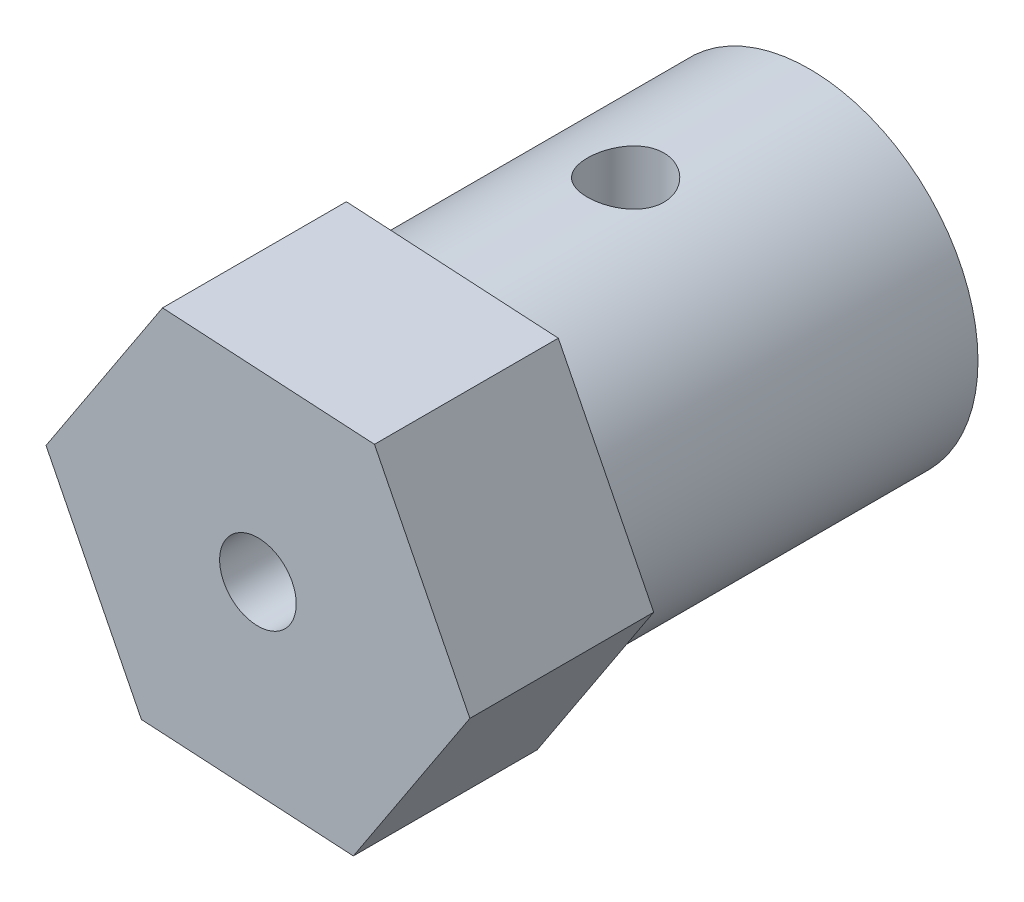
ISO-10303-21;
HEADER;
FILE_DESCRIPTION(('STEP AP214'),'2;1');
FILE_NAME('part.step','',(''),(''),'','','');
FILE_SCHEMA(('AUTOMOTIVE_DESIGN { 1 0 10303 214 1 1 1 1 }'));
ENDSEC;
DATA;
#1=APPLICATION_CONTEXT('core data for automotive mechanical design processes');
#2=APPLICATION_PROTOCOL_DEFINITION('international standard','automotive_design',2000,#1);
#3=PRODUCT_CONTEXT('',#1,'mechanical');
#4=PRODUCT('Part','Part','',(#3));
#5=PRODUCT_RELATED_PRODUCT_CATEGORY('part','',(#4));
#6=PRODUCT_DEFINITION_FORMATION('','',#4);
#7=PRODUCT_DEFINITION_CONTEXT('part definition',#1,'design');
#8=PRODUCT_DEFINITION('design','',#6,#7);
#9=PRODUCT_DEFINITION_SHAPE('','',#8);
#10=(LENGTH_UNIT() NAMED_UNIT(*) SI_UNIT(.MILLI.,.METRE.));
#11=(NAMED_UNIT(*) PLANE_ANGLE_UNIT() SI_UNIT($,.RADIAN.));
#12=(NAMED_UNIT(*) SI_UNIT($,.STERADIAN.) SOLID_ANGLE_UNIT());
#13=UNCERTAINTY_MEASURE_WITH_UNIT(LENGTH_MEASURE(1.E-05),#10,'distance_accuracy_value','');
#14=(GEOMETRIC_REPRESENTATION_CONTEXT(3) GLOBAL_UNCERTAINTY_ASSIGNED_CONTEXT((#13)) GLOBAL_UNIT_ASSIGNED_CONTEXT((#10,
#11,#12)) REPRESENTATION_CONTEXT('',''));
#15=CARTESIAN_POINT('',(0.,0.,0.));
#16=DIRECTION('',(0.,0.,1.));
#17=DIRECTION('',(1.,0.,0.));
#18=AXIS2_PLACEMENT_3D('',#15,#16,#17);
#19=CARTESIAN_POINT('',(-3.11356549489701,6.18916067887985,0.));
#20=DIRECTION('',(-0.835859884863203,0.54894285028268,0.));
#21=DIRECTION('',(-0.54894285028268,-0.835859884863203,0.));
#22=AXIS2_PLACEMENT_3D('',#19,#20,#21);
#23=PLANE('',#22);
#24=DIRECTION('',(-0.54894285028268,-0.835859884863203,0.));
#25=VECTOR('',#24,1.);
#26=CARTESIAN_POINT('',(-3.11356549489701,6.18916067887985,6.));
#27=LINE('',#26,#25);
#28=CARTESIAN_POINT('',(-3.11356549489701,6.18916067887985,6.));
#29=VERTEX_POINT('',#28);
#30=CARTESIAN_POINT('',(-6.91675312346217,0.39815352451281,6.));
#31=VERTEX_POINT('',#30);
#32=EDGE_CURVE('E11',#29,#31,#27,.T.);
#33=ORIENTED_EDGE('',*,*,#32,.F.);
#34=DIRECTION('',(0.,0.,1.));
#35=VECTOR('',#34,1.);
#36=CARTESIAN_POINT('',(-3.11356549489701,6.18916067887985,0.));
#37=LINE('',#36,#35);
#38=CARTESIAN_POINT('',(-3.11356549489701,6.18916067887985,0.));
#39=VERTEX_POINT('',#38);
#40=EDGE_CURVE('E24',#39,#29,#37,.T.);
#41=ORIENTED_EDGE('',*,*,#40,.F.);
#42=DIRECTION('',(-0.54894285028268,-0.835859884863203,0.));
#43=VECTOR('',#42,1.);
#44=CARTESIAN_POINT('',(-3.11356549489701,6.18916067887985,0.));
#45=LINE('',#44,#43);
#46=CARTESIAN_POINT('',(-6.91675312346217,0.39815352451281,0.));
#47=VERTEX_POINT('',#46);
#48=EDGE_CURVE('E197',#39,#47,#45,.T.);
#49=ORIENTED_EDGE('',*,*,#48,.T.);
#50=DIRECTION('',(0.,0.,1.));
#51=VECTOR('',#50,1.);
#52=CARTESIAN_POINT('',(-6.91675312346217,0.39815352451281,0.));
#53=LINE('',#52,#51);
#54=EDGE_CURVE('E194',#47,#31,#53,.T.);
#55=ORIENTED_EDGE('',*,*,#54,.T.);
#56=EDGE_LOOP('',(#33,#41,#49,#55));
#57=FACE_BOUND('',#56,.T.);
#58=ADVANCED_FACE('F17',(#57),#23,.T.);
#59=CARTESIAN_POINT('',(3.80318762856513,5.79100715436707,0.));
#60=DIRECTION('',(0.0574685111390608,0.998347319437209,0.));
#61=DIRECTION('',(-0.998347319437209,0.0574685111390608,0.));
#62=AXIS2_PLACEMENT_3D('',#59,#60,#61);
#63=PLANE('',#62);
#64=DIRECTION('',(-0.998347319437209,0.0574685111390608,0.));
#65=VECTOR('',#64,1.);
#66=CARTESIAN_POINT('',(3.80318762856513,5.79100715436707,6.));
#67=LINE('',#66,#65);
#68=CARTESIAN_POINT('',(3.80318762856513,5.79100715436707,6.));
#69=VERTEX_POINT('',#68);
#70=EDGE_CURVE('E190',#69,#29,#67,.T.);
#71=ORIENTED_EDGE('',*,*,#70,.F.);
#72=DIRECTION('',(0.,0.,1.));
#73=VECTOR('',#72,1.);
#74=CARTESIAN_POINT('',(3.80318762856513,5.79100715436707,0.));
#75=LINE('',#74,#73);
#76=CARTESIAN_POINT('',(3.80318762856513,5.79100715436707,0.));
#77=VERTEX_POINT('',#76);
#78=EDGE_CURVE('E195',#77,#69,#75,.T.);
#79=ORIENTED_EDGE('',*,*,#78,.F.);
#80=DIRECTION('',(-0.998347319437209,0.0574685111390608,0.));
#81=VECTOR('',#80,1.);
#82=CARTESIAN_POINT('',(3.80318762856513,5.79100715436707,0.));
#83=LINE('',#82,#81);
#84=EDGE_CURVE('E199',#77,#39,#83,.T.);
#85=ORIENTED_EDGE('',*,*,#84,.T.);
#86=ORIENTED_EDGE('',*,*,#40,.T.);
#87=EDGE_LOOP('',(#71,#79,#85,#86));
#88=FACE_BOUND('',#87,.T.);
#89=ADVANCED_FACE('F145',(#88),#63,.T.);
#90=CARTESIAN_POINT('',(6.91675312346217,-0.39815352451281,0.));
#91=DIRECTION('',(0.893328396002228,0.449404469154554,0.));
#92=DIRECTION('',(-0.449404469154555,0.893328396002228,0.));
#93=AXIS2_PLACEMENT_3D('',#90,#91,#92);
#94=PLANE('',#93);
#95=DIRECTION('',(-0.449404469154555,0.893328396002228,0.));
#96=VECTOR('',#95,1.);
#97=CARTESIAN_POINT('',(6.91675312346217,-0.39815352451281,6.));
#98=LINE('',#97,#96);
#99=CARTESIAN_POINT('',(6.91675312346217,-0.39815352451281,6.));
#100=VERTEX_POINT('',#99);
#101=EDGE_CURVE('E192',#100,#69,#98,.T.);
#102=ORIENTED_EDGE('',*,*,#101,.F.);
#103=DIRECTION('',(0.,0.,1.));
#104=VECTOR('',#103,1.);
#105=CARTESIAN_POINT('',(6.91675312346217,-0.39815352451281,0.));
#106=LINE('',#105,#104);
#107=CARTESIAN_POINT('',(6.91675312346217,-0.39815352451281,0.));
#108=VERTEX_POINT('',#107);
#109=EDGE_CURVE('E236',#108,#100,#106,.T.);
#110=ORIENTED_EDGE('',*,*,#109,.F.);
#111=DIRECTION('',(-0.449404469154555,0.893328396002228,0.));
#112=VECTOR('',#111,1.);
#113=CARTESIAN_POINT('',(6.91675312346217,-0.39815352451281,0.));
#114=LINE('',#113,#112);
#115=EDGE_CURVE('E234',#108,#77,#114,.T.);
#116=ORIENTED_EDGE('',*,*,#115,.T.);
#117=ORIENTED_EDGE('',*,*,#78,.T.);
#118=EDGE_LOOP('',(#102,#110,#116,#117));
#119=FACE_BOUND('',#118,.T.);
#120=ADVANCED_FACE('F150',(#119),#94,.T.);
#121=CARTESIAN_POINT('',(3.11356549489701,-6.18916067887985,0.));
#122=DIRECTION('',(0.835859884863203,-0.54894285028268,0.));
#123=DIRECTION('',(0.54894285028268,0.835859884863203,0.));
#124=AXIS2_PLACEMENT_3D('',#121,#122,#123);
#125=PLANE('',#124);
#126=DIRECTION('',(0.54894285028268,0.835859884863203,0.));
#127=VECTOR('',#126,1.);
#128=CARTESIAN_POINT('',(3.11356549489701,-6.18916067887985,6.));
#129=LINE('',#128,#127);
#130=CARTESIAN_POINT('',(3.11356549489701,-6.18916067887985,6.));
#131=VERTEX_POINT('',#130);
#132=EDGE_CURVE('E232',#131,#100,#129,.T.);
#133=ORIENTED_EDGE('',*,*,#132,.F.);
#134=DIRECTION('',(0.,0.,1.));
#135=VECTOR('',#134,1.);
#136=CARTESIAN_POINT('',(3.11356549489701,-6.18916067887985,0.));
#137=LINE('',#136,#135);
#138=CARTESIAN_POINT('',(3.11356549489701,-6.18916067887985,0.));
#139=VERTEX_POINT('',#138);
#140=EDGE_CURVE('E229',#139,#131,#137,.T.);
#141=ORIENTED_EDGE('',*,*,#140,.F.);
#142=DIRECTION('',(0.54894285028268,0.835859884863203,0.));
#143=VECTOR('',#142,1.);
#144=CARTESIAN_POINT('',(3.11356549489701,-6.18916067887985,0.));
#145=LINE('',#144,#143);
#146=EDGE_CURVE('E226',#139,#108,#145,.T.);
#147=ORIENTED_EDGE('',*,*,#146,.T.);
#148=ORIENTED_EDGE('',*,*,#109,.T.);
#149=EDGE_LOOP('',(#133,#141,#147,#148));
#150=FACE_BOUND('',#149,.T.);
#151=ADVANCED_FACE('F155',(#150),#125,.T.);
#152=CARTESIAN_POINT('',(-3.80318762856507,-5.79100715436703,0.));
#153=DIRECTION('',(-0.0574685111390663,-0.998347319437208,0.));
#154=DIRECTION('',(0.998347319437208,-0.0574685111390663,0.));
#155=AXIS2_PLACEMENT_3D('',#152,#153,#154);
#156=PLANE('',#155);
#157=DIRECTION('',(0.998347319437208,-0.0574685111390663,0.));
#158=VECTOR('',#157,1.);
#159=CARTESIAN_POINT('',(-3.80318762856507,-5.79100715436703,6.));
#160=LINE('',#159,#158);
#161=CARTESIAN_POINT('',(-3.80318762856507,-5.79100715436703,6.));
#162=VERTEX_POINT('',#161);
#163=EDGE_CURVE('E224',#162,#131,#160,.T.);
#164=ORIENTED_EDGE('',*,*,#163,.F.);
#165=DIRECTION('',(0.,0.,1.));
#166=VECTOR('',#165,1.);
#167=CARTESIAN_POINT('',(-3.80318762856507,-5.79100715436703,0.));
#168=LINE('',#167,#166);
#169=CARTESIAN_POINT('',(-3.80318762856507,-5.79100715436703,0.));
#170=VERTEX_POINT('',#169);
#171=EDGE_CURVE('E214',#170,#162,#168,.T.);
#172=ORIENTED_EDGE('',*,*,#171,.F.);
#173=DIRECTION('',(0.998347319437208,-0.0574685111390663,0.));
#174=VECTOR('',#173,1.);
#175=CARTESIAN_POINT('',(-3.80318762856507,-5.79100715436703,0.));
#176=LINE('',#175,#174);
#177=EDGE_CURVE('E215',#170,#139,#176,.T.);
#178=ORIENTED_EDGE('',*,*,#177,.T.);
#179=ORIENTED_EDGE('',*,*,#140,.T.);
#180=EDGE_LOOP('',(#164,#172,#178,#179));
#181=FACE_BOUND('',#180,.T.);
#182=ADVANCED_FACE('F161',(#181),#156,.T.);
#183=CARTESIAN_POINT('',(-6.91675312346217,0.39815352451281,0.));
#184=DIRECTION('',(-0.893328396002223,-0.449404469154564,0.));
#185=DIRECTION('',(0.449404469154564,-0.893328396002223,0.));
#186=AXIS2_PLACEMENT_3D('',#183,#184,#185);
#187=PLANE('',#186);
#188=DIRECTION('',(0.449404469154564,-0.893328396002223,0.));
#189=VECTOR('',#188,1.);
#190=CARTESIAN_POINT('',(-6.91675312346217,0.39815352451281,6.));
#191=LINE('',#190,#189);
#192=EDGE_CURVE('E188',#31,#162,#191,.T.);
#193=ORIENTED_EDGE('',*,*,#192,.F.);
#194=ORIENTED_EDGE('',*,*,#54,.F.);
#195=DIRECTION('',(0.449404469154564,-0.893328396002223,0.));
#196=VECTOR('',#195,1.);
#197=CARTESIAN_POINT('',(-6.91675312346217,0.39815352451281,0.));
#198=LINE('',#197,#196);
#199=EDGE_CURVE('E211',#47,#170,#198,.T.);
#200=ORIENTED_EDGE('',*,*,#199,.T.);
#201=ORIENTED_EDGE('',*,*,#171,.T.);
#202=EDGE_LOOP('',(#193,#194,#200,#201));
#203=FACE_BOUND('',#202,.T.);
#204=ADVANCED_FACE('F165',(#203),#187,.T.);
#205=CARTESIAN_POINT('',(0.,0.,0.));
#206=DIRECTION('',(0.,0.,1.));
#207=DIRECTION('',(1.,0.,0.));
#208=AXIS2_PLACEMENT_3D('',#205,#206,#207);
#209=PLANE('',#208);
#210=CARTESIAN_POINT('',(0.,0.,0.));
#211=DIRECTION('',(0.,0.,1.));
#212=DIRECTION('',(1.,0.,0.));
#213=AXIS2_PLACEMENT_3D('',#210,#211,#212);
#214=CIRCLE('',#213,5.5);
#215=CARTESIAN_POINT('',(5.5,0.,0.));
#216=VERTEX_POINT('',#215);
#217=EDGE_CURVE('E219',#216,#216,#214,.T.);
#218=ORIENTED_EDGE('',*,*,#217,.T.);
#219=EDGE_LOOP('',(#218));
#220=FACE_BOUND('',#219,.T.);
#221=ORIENTED_EDGE('',*,*,#48,.F.);
#222=ORIENTED_EDGE('',*,*,#84,.F.);
#223=ORIENTED_EDGE('',*,*,#115,.F.);
#224=ORIENTED_EDGE('',*,*,#146,.F.);
#225=ORIENTED_EDGE('',*,*,#177,.F.);
#226=ORIENTED_EDGE('',*,*,#199,.F.);
#227=EDGE_LOOP('',(#221,#222,#223,#224,#225,#226));
#228=FACE_BOUND('',#227,.T.);
#229=ADVANCED_FACE('F169',(#220,#228),#209,.F.);
#230=CARTESIAN_POINT('',(0.,0.,6.));
#231=DIRECTION('',(0.,0.,1.));
#232=DIRECTION('',(1.,0.,0.));
#233=AXIS2_PLACEMENT_3D('',#230,#231,#232);
#234=PLANE('',#233);
#235=CARTESIAN_POINT('',(0.,0.,6.));
#236=DIRECTION('',(0.,0.,1.));
#237=DIRECTION('',(1.,0.,0.));
#238=AXIS2_PLACEMENT_3D('',#235,#236,#237);
#239=CIRCLE('',#238,1.24999999999999);
#240=CARTESIAN_POINT('',(1.24999999999999,0.,6.));
#241=VERTEX_POINT('',#240);
#242=EDGE_CURVE('E183',#241,#241,#239,.T.);
#243=ORIENTED_EDGE('',*,*,#242,.F.);
#244=EDGE_LOOP('',(#243));
#245=FACE_BOUND('',#244,.T.);
#246=ORIENTED_EDGE('',*,*,#32,.T.);
#247=ORIENTED_EDGE('',*,*,#192,.T.);
#248=ORIENTED_EDGE('',*,*,#163,.T.);
#249=ORIENTED_EDGE('',*,*,#132,.T.);
#250=ORIENTED_EDGE('',*,*,#101,.T.);
#251=ORIENTED_EDGE('',*,*,#70,.T.);
#252=EDGE_LOOP('',(#246,#247,#248,#249,#250,#251));
#253=FACE_BOUND('',#252,.T.);
#254=ADVANCED_FACE('F172',(#245,#253),#234,.T.);
#255=CARTESIAN_POINT('',(0.,0.,-11.));
#256=DIRECTION('',(0.,0.,1.));
#257=DIRECTION('',(1.,0.,0.));
#258=AXIS2_PLACEMENT_3D('',#255,#256,#257);
#259=CYLINDRICAL_SURFACE('',#258,5.5);
#260=CARTESIAN_POINT('',(0.,-5.5,-7.24999999999999));
#261=CARTESIAN_POINT('',(0.0692591392984506,-5.49999873675926,-7.24999773408679));
#262=CARTESIAN_POINT('',(0.138545086129002,-5.49867854673065,-7.24422438621154));
#263=CARTESIAN_POINT('',(0.275144297299659,-5.493539660153,-7.22131026196915));
#264=CARTESIAN_POINT('',(0.342456196110362,-5.48971927481324,-7.20416180202236));
#265=CARTESIAN_POINT('',(0.473113835992454,-5.48000476561469,-7.15906597568405));
#266=CARTESIAN_POINT('',(0.536463797478232,-5.4741128942837,-7.13113033600963));
#267=CARTESIAN_POINT('',(0.657576137912824,-5.46088910081351,-7.06529144330956));
#268=CARTESIAN_POINT('',(0.715338572515905,-5.45355719301993,-7.02738828957879));
#269=CARTESIAN_POINT('',(0.824633802223183,-5.4381132908407,-6.94199897769666));
#270=CARTESIAN_POINT('',(0.876056469460239,-5.42999098791629,-6.89437371326249));
#271=CARTESIAN_POINT('',(0.970256949083045,-5.41395325591652,-6.79119051293137));
#272=CARTESIAN_POINT('',(1.01303394060891,-5.40603784654665,-6.73563182465277));
#273=CARTESIAN_POINT('',(1.08922299700893,-5.39120791846105,-6.61733397235815));
#274=CARTESIAN_POINT('',(1.12251627178287,-5.38430657902887,-6.55451650184708));
#275=CARTESIAN_POINT('',(1.17803034858934,-5.37243480737543,-6.42399524970919));
#276=CARTESIAN_POINT('',(1.20025258858874,-5.36746412440839,-6.35629210396919));
#277=CARTESIAN_POINT('',(1.23262674706358,-5.36012172349153,-6.21912040644173));
#278=CARTESIAN_POINT('',(1.24297446340376,-5.3577078986695,-6.14970036843873));
#279=CARTESIAN_POINT('',(1.25191494225743,-5.35562617033839,-6.01007088639345));
#280=CARTESIAN_POINT('',(1.25050926943275,-5.35595790132902,-5.93986154866886));
#281=CARTESIAN_POINT('',(1.2361400847938,-5.35929175179597,-5.80211355832565));
#282=CARTESIAN_POINT('',(1.22340552299718,-5.36224097064878,-5.73454954690255));
#283=CARTESIAN_POINT('',(1.1871034246025,-5.37039368363716,-5.60254275692259));
#284=CARTESIAN_POINT('',(1.16353523702144,-5.3755973132372,-5.53810016618641));
#285=CARTESIAN_POINT('',(1.10602867201271,-5.38772371922684,-5.41352966409474));
#286=CARTESIAN_POINT('',(1.07200356043003,-5.39466077989125,-5.35344324111816));
#287=CARTESIAN_POINT('',(0.994609889602034,-5.40946384216207,-5.23974872344447));
#288=CARTESIAN_POINT('',(0.951239961185667,-5.41732997981731,-5.18614157986804));
#289=CARTESIAN_POINT('',(0.855182590017578,-5.43333076436253,-5.0856107190895));
#290=CARTESIAN_POINT('',(0.802300833714133,-5.44146738675749,-5.03887278674183));
#291=CARTESIAN_POINT('',(0.689356149204859,-5.45692512985791,-4.95489705564645));
#292=CARTESIAN_POINT('',(0.629293070045398,-5.46424623341466,-4.91765945665027));
#293=CARTESIAN_POINT('',(0.503453995899576,-5.47727487123187,-4.85368980601426));
#294=CARTESIAN_POINT('',(0.437664417174078,-5.48297842424367,-4.82698361318884));
#295=CARTESIAN_POINT('',(0.302372561245849,-5.49209994783491,-4.78505799706605));
#296=CARTESIAN_POINT('',(0.232870869831861,-5.4955182778892,-4.76983676708892));
#297=CARTESIAN_POINT('',(0.093719920096368,-5.4996325035878,-4.75158688126366));
#298=CARTESIAN_POINT('',(0.0241055461685212,-5.50038500920564,-4.74830465434164));
#299=CARTESIAN_POINT('',(-0.114676943340049,-5.49924211275316,-4.75333651992647));
#300=CARTESIAN_POINT('',(-0.183845091360426,-5.49734690539558,-4.76164975970299));
#301=CARTESIAN_POINT('',(-0.318920838609226,-5.49115740518707,-4.78942658345272));
#302=CARTESIAN_POINT('',(-0.38485751840721,-5.4868920435275,-4.80875577322187));
#303=CARTESIAN_POINT('',(-0.512551965438798,-5.47644030661836,-4.85786551372854));
#304=CARTESIAN_POINT('',(-0.574309357161439,-5.47025375902772,-4.88764700212664));
#305=CARTESIAN_POINT('',(-0.692930426280274,-5.45650716375474,-4.95733457177767));
#306=CARTESIAN_POINT('',(-0.749705342613592,-5.4489276492766,-4.99738781338658));
#307=CARTESIAN_POINT('',(-0.855818867895255,-5.43327304782299,-5.08628966422011));
#308=CARTESIAN_POINT('',(-0.905156426789842,-5.42519789109562,-5.13513951327343));
#309=CARTESIAN_POINT('',(-0.996008531090472,-5.40926438572434,-5.24141548256671));
#310=CARTESIAN_POINT('',(-1.0373468329703,-5.40141360596267,-5.29899362089341));
#311=CARTESIAN_POINT('',(-1.10976907203276,-5.3870011660802,-5.42042319533514));
#312=CARTESIAN_POINT('',(-1.14085346250508,-5.38043944897962,-5.48427435397981));
#313=CARTESIAN_POINT('',(-1.19166798620963,-5.36941374353368,-5.61609023478446));
#314=CARTESIAN_POINT('',(-1.21146358110851,-5.3649376890851,-5.68402866187168));
#315=CARTESIAN_POINT('',(-1.23932629170182,-5.35857055292907,-5.82238345334956));
#316=CARTESIAN_POINT('',(-1.24739545670806,-5.35667901955397,-5.8927993825682));
#317=CARTESIAN_POINT('',(-1.25148369607082,-5.35572514716112,-6.03232930965545));
#318=CARTESIAN_POINT('',(-1.24778274250535,-5.35659707290885,-6.1014347996668));
#319=CARTESIAN_POINT('',(-1.22906557701641,-5.3609223423457,-6.23800945509413));
#320=CARTESIAN_POINT('',(-1.21404952108504,-5.36437565044739,-6.30547864305523));
#321=CARTESIAN_POINT('',(-1.17326846180304,-5.37344130135242,-6.43662169868314));
#322=CARTESIAN_POINT('',(-1.14754728763997,-5.37904483343351,-6.50030984557075));
#323=CARTESIAN_POINT('',(-1.08612268303439,-5.39178236164052,-6.6225073534503));
#324=CARTESIAN_POINT('',(-1.05041811865611,-5.39891653159829,-6.68101612516275));
#325=CARTESIAN_POINT('',(-0.969124984455241,-5.41410553631702,-6.79256721382763));
#326=CARTESIAN_POINT('',(-0.923338228214166,-5.42217702793932,-6.84546286110368));
#327=CARTESIAN_POINT('',(-0.823578144662083,-5.43822274296525,-6.94291159254097));
#328=CARTESIAN_POINT('',(-0.769602917703374,-5.44619694333323,-6.98746273548298));
#329=CARTESIAN_POINT('',(-0.654070302575279,-5.46128466945207,-7.06756903011685));
#330=CARTESIAN_POINT('',(-0.592415810938096,-5.46838430808557,-7.10298691166656));
#331=CARTESIAN_POINT('',(-0.463877983855843,-5.48078202756997,-7.16289998533147));
#332=CARTESIAN_POINT('',(-0.396998922168846,-5.48608156233362,-7.18740399739333));
#333=CARTESIAN_POINT('',(-0.27508153576981,-5.49337797563919,-7.22061395308805));
#334=CARTESIAN_POINT('',(-0.220684055569244,-5.49584542792493,-7.23161199384464));
#335=CARTESIAN_POINT('',(-0.110863407465459,-5.49915690403688,-7.24630573678966));
#336=CARTESIAN_POINT('',(-0.0554402923585513,-5.50000101119415,-7.25000181380958));
#337=CARTESIAN_POINT('',(0.,-5.5,-7.24999999999999));
#338=B_SPLINE_CURVE_WITH_KNOTS('',3,(#260,#261,#262,#263,#264,#265,#266,#267,#268,#269,#270,
#271,#272,#273,#274,#275,#276,#277,#278,#279,#280,#281,#282,#283,#284,#285,#286,#287,#288,#289,
#290,#291,#292,#293,#294,#295,#296,#297,#298,#299,#300,#301,#302,#303,#304,#305,#306,#307,#308,
#309,#310,#311,#312,#313,#314,#315,#316,#317,#318,#319,#320,#321,#322,#323,#324,#325,#326,#327,
#328,#329,#330,#331,#332,#333,#334,#335,#336,#337),.UNSPECIFIED.,.T.,.F.,(4,2,2,2,2,2,2,2,2,2,2,
2,2,2,2,2,2,2,2,2,2,2,2,2,2,2,2,2,2,2,2,2,2,2,2,2,2,2,4),(0.,0.207574424816656,
0.415289203498462,0.622778808776588,0.830266347152619,1.04096194698404,1.251677541829,
1.46492681486706,1.67814838269118,1.8878012244904,2.09742615684377,2.30290857087116,
2.50840333376984,2.71565078719423,2.92292862648987,3.1350576590185,3.34719115134929,
3.55984232048321,3.77246003084945,3.98053470958378,4.18859408731811,4.39416788074515,
4.59976012061539,4.80848064664381,5.01723061362834,5.23015660770195,5.44307318779736,
5.65474220954491,5.86637423554695,6.07301021975723,6.27964335529764,6.48543868288069,
6.69125739465897,6.9015551289295,7.11190172510029,7.32524638726728,7.53841832261073,
7.70458523862174,7.87074362456996),.UNSPECIFIED.);
#339=CARTESIAN_POINT('',(0.,-5.5,-7.24999999999999));
#340=VERTEX_POINT('',#339);
#341=EDGE_CURVE('E108',#340,#340,#338,.T.);
#342=ORIENTED_EDGE('',*,*,#341,.F.);
#343=EDGE_LOOP('',(#342));
#344=FACE_BOUND('',#343,.T.);
#345=CARTESIAN_POINT('',(0.,5.5,-7.24999999999999));
#346=CARTESIAN_POINT('',(-0.0692591392984518,5.49999873675926,-7.24999773408679));
#347=CARTESIAN_POINT('',(-0.138545086129003,5.49867854673065,-7.24422438621154));
#348=CARTESIAN_POINT('',(-0.27514429729966,5.493539660153,-7.22131026196915));
#349=CARTESIAN_POINT('',(-0.342456196110363,5.48971927481324,-7.20416180202236));
#350=CARTESIAN_POINT('',(-0.473113835992455,5.48000476561469,-7.15906597568405));
#351=CARTESIAN_POINT('',(-0.536463797478233,5.4741128942837,-7.13113033600963));
#352=CARTESIAN_POINT('',(-0.657576137912826,5.46088910081351,-7.06529144330956));
#353=CARTESIAN_POINT('',(-0.715338572515906,5.45355719301993,-7.02738828957879));
#354=CARTESIAN_POINT('',(-0.824633802223185,5.4381132908407,-6.94199897769666));
#355=CARTESIAN_POINT('',(-0.87605646946024,5.42999098791629,-6.89437371326249));
#356=CARTESIAN_POINT('',(-0.970256949083047,5.41395325591652,-6.79119051293137));
#357=CARTESIAN_POINT('',(-1.01303394060891,5.40603784654666,-6.73563182465277));
#358=CARTESIAN_POINT('',(-1.08922299700893,5.39120791846105,-6.61733397235815));
#359=CARTESIAN_POINT('',(-1.12251627178287,5.38430657902887,-6.55451650184708));
#360=CARTESIAN_POINT('',(-1.17803034858934,5.37243480737543,-6.42399524970919));
#361=CARTESIAN_POINT('',(-1.20025258858874,5.36746412440839,-6.35629210396919));
#362=CARTESIAN_POINT('',(-1.23262674706358,5.36012172349153,-6.21912040644173));
#363=CARTESIAN_POINT('',(-1.24297446340376,5.35770789866951,-6.14970036843873));
#364=CARTESIAN_POINT('',(-1.25191494225743,5.35562617033839,-6.01007088639345));
#365=CARTESIAN_POINT('',(-1.25050926943275,5.35595790132902,-5.93986154866886));
#366=CARTESIAN_POINT('',(-1.2361400847938,5.35929175179597,-5.80211355832565));
#367=CARTESIAN_POINT('',(-1.22340552299718,5.36224097064878,-5.73454954690255));
#368=CARTESIAN_POINT('',(-1.1871034246025,5.37039368363716,-5.60254275692259));
#369=CARTESIAN_POINT('',(-1.16353523702143,5.3755973132372,-5.53810016618641));
#370=CARTESIAN_POINT('',(-1.10602867201271,5.38772371922684,-5.41352966409474));
#371=CARTESIAN_POINT('',(-1.07200356043003,5.39466077989125,-5.35344324111816));
#372=CARTESIAN_POINT('',(-0.994609889602033,5.40946384216207,-5.23974872344447));
#373=CARTESIAN_POINT('',(-0.951239961185665,5.41732997981731,-5.18614157986804));
#374=CARTESIAN_POINT('',(-0.855182590017577,5.43333076436253,-5.08561071908949));
#375=CARTESIAN_POINT('',(-0.802300833714132,5.44146738675749,-5.03887278674183));
#376=CARTESIAN_POINT('',(-0.689356149204857,5.45692512985791,-4.95489705564645));
#377=CARTESIAN_POINT('',(-0.629293070045397,5.46424623341466,-4.91765945665027));
#378=CARTESIAN_POINT('',(-0.503453995899574,5.47727487123187,-4.85368980601425));
#379=CARTESIAN_POINT('',(-0.437664417174076,5.48297842424367,-4.82698361318884));
#380=CARTESIAN_POINT('',(-0.302372561245847,5.49209994783491,-4.78505799706604));
#381=CARTESIAN_POINT('',(-0.232870869831859,5.4955182778892,-4.76983676708892));
#382=CARTESIAN_POINT('',(-0.093719920096366,5.4996325035878,-4.75158688126366));
#383=CARTESIAN_POINT('',(-0.0241055461685192,5.50038500920564,-4.74830465434164));
#384=CARTESIAN_POINT('',(0.114676943340051,5.49924211275316,-4.75333651992647));
#385=CARTESIAN_POINT('',(0.183845091360428,5.49734690539558,-4.76164975970299));
#386=CARTESIAN_POINT('',(0.318920838609228,5.49115740518707,-4.78942658345272));
#387=CARTESIAN_POINT('',(0.384857518407211,5.4868920435275,-4.80875577322187));
#388=CARTESIAN_POINT('',(0.5125519654388,5.47644030661836,-4.85786551372854));
#389=CARTESIAN_POINT('',(0.574309357161441,5.47025375902772,-4.88764700212664));
#390=CARTESIAN_POINT('',(0.692930426280276,5.45650716375474,-4.95733457177768));
#391=CARTESIAN_POINT('',(0.749705342613593,5.4489276492766,-4.99738781338659));
#392=CARTESIAN_POINT('',(0.855818867895256,5.43327304782299,-5.08628966422011));
#393=CARTESIAN_POINT('',(0.905156426789843,5.42519789109562,-5.13513951327343));
#394=CARTESIAN_POINT('',(0.996008531090473,5.40926438572434,-5.24141548256672));
#395=CARTESIAN_POINT('',(1.0373468329703,5.40141360596267,-5.29899362089341));
#396=CARTESIAN_POINT('',(1.10976907203276,5.3870011660802,-5.42042319533514));
#397=CARTESIAN_POINT('',(1.14085346250508,5.38043944897962,-5.48427435397982));
#398=CARTESIAN_POINT('',(1.19166798620963,5.36941374353368,-5.61609023478446));
#399=CARTESIAN_POINT('',(1.21146358110852,5.3649376890851,-5.68402866187168));
#400=CARTESIAN_POINT('',(1.23932629170182,5.35857055292907,-5.82238345334956));
#401=CARTESIAN_POINT('',(1.24739545670806,5.35667901955397,-5.8927993825682));
#402=CARTESIAN_POINT('',(1.25148369607082,5.35572514716112,-6.03232930965545));
#403=CARTESIAN_POINT('',(1.24778274250535,5.35659707290885,-6.1014347996668));
#404=CARTESIAN_POINT('',(1.22906557701641,5.3609223423457,-6.23800945509413));
#405=CARTESIAN_POINT('',(1.21404952108504,5.36437565044739,-6.30547864305523));
#406=CARTESIAN_POINT('',(1.17326846180304,5.37344130135242,-6.43662169868314));
#407=CARTESIAN_POINT('',(1.14754728763997,5.37904483343351,-6.50030984557075));
#408=CARTESIAN_POINT('',(1.08612268303439,5.39178236164053,-6.6225073534503));
#409=CARTESIAN_POINT('',(1.05041811865611,5.39891653159829,-6.68101612516275));
#410=CARTESIAN_POINT('',(0.969124984455239,5.41410553631702,-6.79256721382763));
#411=CARTESIAN_POINT('',(0.923338228214164,5.42217702793932,-6.84546286110368));
#412=CARTESIAN_POINT('',(0.823578144662081,5.43822274296525,-6.94291159254097));
#413=CARTESIAN_POINT('',(0.769602917703373,5.44619694333323,-6.98746273548298));
#414=CARTESIAN_POINT('',(0.654070302575278,5.46128466945207,-7.06756903011685));
#415=CARTESIAN_POINT('',(0.592415810938095,5.46838430808557,-7.10298691166656));
#416=CARTESIAN_POINT('',(0.463877983855841,5.48078202756997,-7.16289998533147));
#417=CARTESIAN_POINT('',(0.396998922168844,5.48608156233362,-7.18740399739333));
#418=CARTESIAN_POINT('',(0.275081535769808,5.49337797563919,-7.22061395308805));
#419=CARTESIAN_POINT('',(0.220684055569243,5.49584542792493,-7.23161199384464));
#420=CARTESIAN_POINT('',(0.110863407465457,5.49915690403688,-7.24630573678966));
#421=CARTESIAN_POINT('',(0.05544029235855,5.50000101119414,-7.25000181380958));
#422=CARTESIAN_POINT('',(0.,5.5,-7.24999999999999));
#423=B_SPLINE_CURVE_WITH_KNOTS('',3,(#345,#346,#347,#348,#349,#350,#351,#352,#353,#354,#355,
#356,#357,#358,#359,#360,#361,#362,#363,#364,#365,#366,#367,#368,#369,#370,#371,#372,#373,#374,
#375,#376,#377,#378,#379,#380,#381,#382,#383,#384,#385,#386,#387,#388,#389,#390,#391,#392,#393,
#394,#395,#396,#397,#398,#399,#400,#401,#402,#403,#404,#405,#406,#407,#408,#409,#410,#411,#412,
#413,#414,#415,#416,#417,#418,#419,#420,#421,#422),.UNSPECIFIED.,.T.,.F.,(4,2,2,2,2,2,2,2,2,2,2,
2,2,2,2,2,2,2,2,2,2,2,2,2,2,2,2,2,2,2,2,2,2,2,2,2,2,2,4),(0.,0.207574424816657,
0.415289203498462,0.622778808776589,0.83026634715262,1.04096194698404,1.251677541829,
1.46492681486706,1.67814838269118,1.8878012244904,2.09742615684377,2.30290857087116,
2.50840333376984,2.71565078719424,2.92292862648987,3.1350576590185,3.34719115134929,
3.55984232048322,3.77246003084945,3.98053470958378,4.18859408731811,4.39416788074515,
4.59976012061539,4.80848064664381,5.01723061362834,5.23015660770195,5.44307318779736,
5.65474220954492,5.86637423554696,6.07301021975723,6.27964335529764,6.48543868288069,
6.69125739465897,6.9015551289295,7.11190172510029,7.32524638726728,7.53841832261073,
7.70458523862175,7.87074362456996),.UNSPECIFIED.);
#424=CARTESIAN_POINT('',(0.,5.5,-7.24999999999999));
#425=VERTEX_POINT('',#424);
#426=EDGE_CURVE('E116',#425,#425,#423,.T.);
#427=ORIENTED_EDGE('',*,*,#426,.F.);
#428=EDGE_LOOP('',(#427));
#429=FACE_BOUND('',#428,.T.);
#430=CARTESIAN_POINT('',(0.,0.,-12.));
#431=DIRECTION('',(0.,0.,1.));
#432=DIRECTION('',(1.,0.,0.));
#433=AXIS2_PLACEMENT_3D('',#430,#431,#432);
#434=CIRCLE('',#433,5.5);
#435=CARTESIAN_POINT('',(5.5,0.,-12.));
#436=VERTEX_POINT('',#435);
#437=EDGE_CURVE('E123',#436,#436,#434,.T.);
#438=ORIENTED_EDGE('',*,*,#437,.T.);
#439=EDGE_LOOP('',(#438));
#440=FACE_BOUND('',#439,.T.);
#441=ORIENTED_EDGE('',*,*,#217,.F.);
#442=EDGE_LOOP('',(#441));
#443=FACE_BOUND('',#442,.T.);
#444=ADVANCED_FACE('F102',(#344,#429,#440,#443),#259,.T.);
#445=CARTESIAN_POINT('',(5.5,0.,-12.));
#446=DIRECTION('',(0.,0.,-1.));
#447=DIRECTION('',(-1.,0.,0.));
#448=AXIS2_PLACEMENT_3D('',#445,#446,#447);
#449=PLANE('',#448);
#450=CARTESIAN_POINT('',(0.,0.,-12.));
#451=DIRECTION('',(0.,0.,-1.));
#452=DIRECTION('',(-1.,0.,0.));
#453=AXIS2_PLACEMENT_3D('',#450,#451,#452);
#454=CIRCLE('',#453,2.99999999999999);
#455=CARTESIAN_POINT('',(-2.99999999999999,0.,-12.));
#456=VERTEX_POINT('',#455);
#457=EDGE_CURVE('E126',#456,#456,#454,.T.);
#458=ORIENTED_EDGE('',*,*,#457,.F.);
#459=EDGE_LOOP('',(#458));
#460=FACE_BOUND('',#459,.T.);
#461=ORIENTED_EDGE('',*,*,#437,.F.);
#462=EDGE_LOOP('',(#461));
#463=FACE_BOUND('',#462,.T.);
#464=ADVANCED_FACE('F101',(#460,#463),#449,.T.);
#465=CARTESIAN_POINT('',(0.,0.,-3.00000000000001));
#466=DIRECTION('',(0.,0.,1.));
#467=DIRECTION('',(1.,0.,0.));
#468=AXIS2_PLACEMENT_3D('',#465,#466,#467);
#469=PLANE('',#468);
#470=CARTESIAN_POINT('',(0.,0.,-3.00000000000001));
#471=DIRECTION('',(0.,0.,-1.));
#472=DIRECTION('',(-1.,0.,0.));
#473=AXIS2_PLACEMENT_3D('',#470,#471,#472);
#474=CIRCLE('',#473,2.99999999999999);
#475=CARTESIAN_POINT('',(-2.99999999999999,0.,-3.00000000000001));
#476=VERTEX_POINT('',#475);
#477=EDGE_CURVE('E128',#476,#476,#474,.T.);
#478=ORIENTED_EDGE('',*,*,#477,.T.);
#479=EDGE_LOOP('',(#478));
#480=FACE_BOUND('',#479,.T.);
#481=ADVANCED_FACE('F143',(#480),#469,.F.);
#482=CARTESIAN_POINT('',(0.,0.,-11.));
#483=DIRECTION('',(0.,0.,-1.));
#484=DIRECTION('',(-1.,0.,0.));
#485=AXIS2_PLACEMENT_3D('',#482,#483,#484);
#486=CYLINDRICAL_SURFACE('',#485,2.99999999999999);
#487=CARTESIAN_POINT('',(0.,2.99999999999999,-7.24999999999999));
#488=CARTESIAN_POINT('',(-0.0669580526362665,2.99999458367272,-7.2499927949087));
#489=CARTESIAN_POINT('',(-0.13402139706384,2.99773232974709,-7.24458804147186));
#490=CARTESIAN_POINT('',(-0.266247371156346,2.98890153579551,-7.22316093507982));
#491=CARTESIAN_POINT('',(-0.331404576423563,2.98232175901027,-7.20711087553575));
#492=CARTESIAN_POINT('',(-0.457688733653085,2.96556289038126,-7.16508890821941));
#493=CARTESIAN_POINT('',(-0.518828524426266,2.95539599975003,-7.13915061053185));
#494=CARTESIAN_POINT('',(-0.635829756679799,2.93245286470663,-7.07822717676743));
#495=CARTESIAN_POINT('',(-0.691692790015936,2.91967741092848,-7.04324478102913));
#496=CARTESIAN_POINT('',(-0.799448403559508,2.89207828351868,-6.96337101740912));
#497=CARTESIAN_POINT('',(-0.851041267517764,2.87718753326092,-6.91809869121024));
#498=CARTESIAN_POINT('',(-0.946159821091257,2.84732714068513,-6.81973566521743));
#499=CARTESIAN_POINT('',(-0.98968126315308,2.83235746106808,-6.76664087510549));
#500=CARTESIAN_POINT('',(-1.06953737697065,2.80321021812994,-6.6509732224351));
#501=CARTESIAN_POINT('',(-1.10541308153924,2.78910786873384,-6.58806255157345));
#502=CARTESIAN_POINT('',(-1.16593940588865,2.76435572357004,-6.45642674207907));
#503=CARTESIAN_POINT('',(-1.1905958083629,2.75370415000823,-6.38770462051554));
#504=CARTESIAN_POINT('',(-1.22674598312158,2.73778555387704,-6.24984630823208));
#505=CARTESIAN_POINT('',(-1.23881657877605,2.73228387651786,-6.18088951660785));
#506=CARTESIAN_POINT('',(-1.25125209967796,2.72661326219503,-6.04172670731343));
#507=CARTESIAN_POINT('',(-1.25162348054397,2.72644138425259,-5.97152139997426));
#508=CARTESIAN_POINT('',(-1.24108450363673,2.73125119560852,-5.83759993956506));
#509=CARTESIAN_POINT('',(-1.231036811123,2.73583882723622,-5.77379890343554));
#510=CARTESIAN_POINT('',(-1.20139191015776,2.74898482773796,-5.64888790899961));
#511=CARTESIAN_POINT('',(-1.18179287287176,2.75754395703563,-5.58777846850823));
#512=CARTESIAN_POINT('',(-1.1332195872757,2.77786184772756,-5.46844229700856));
#513=CARTESIAN_POINT('',(-1.10405471539235,2.78968481949135,-5.41030457908662));
#514=CARTESIAN_POINT('',(-1.03731242580562,2.81518331141085,-5.29952226611986));
#515=CARTESIAN_POINT('',(-0.999731690519539,2.82885956129779,-5.24687984938649));
#516=CARTESIAN_POINT('',(-0.913495965543831,2.85792976877978,-5.14390004126717));
#517=CARTESIAN_POINT('',(-0.864173483207522,2.87337121404472,-5.09413343261457));
#518=CARTESIAN_POINT('',(-0.757729591051508,2.90325673112528,-5.00338649704082));
#519=CARTESIAN_POINT('',(-0.700606359448453,2.91770056877009,-4.96240822830783));
#520=CARTESIAN_POINT('',(-0.578447948693374,2.94438283556472,-4.88956417638374));
#521=CARTESIAN_POINT('',(-0.513260582447678,2.95656266543333,-4.85793055484932));
#522=CARTESIAN_POINT('',(-0.377852402526831,2.97689481414802,-4.80627886039675));
#523=CARTESIAN_POINT('',(-0.307634394795034,2.98504935845799,-4.78625436805619));
#524=CARTESIAN_POINT('',(-0.168928113346228,2.99599641186384,-4.75958400787337));
#525=CARTESIAN_POINT('',(-0.100611285278639,2.99909541047124,-4.75217214255626));
#526=CARTESIAN_POINT('',(0.0363546554960883,3.00056050368744,-4.74865377638591));
#527=CARTESIAN_POINT('',(0.105003667152635,2.99892795711938,-4.75254402974801));
#528=CARTESIAN_POINT('',(0.237098242341433,2.99131217656939,-4.77097108480607));
#529=CARTESIAN_POINT('',(0.300632966639384,2.98554887283988,-4.7849699540972));
#530=CARTESIAN_POINT('',(0.424382748971088,2.97048606772413,-4.82246819454079));
#531=CARTESIAN_POINT('',(0.484597386518358,2.96118611959703,-4.84596876595031));
#532=CARTESIAN_POINT('',(0.602108999869133,2.93958270645165,-4.90257097571212));
#533=CARTESIAN_POINT('',(0.659257236855321,2.9271949146928,-4.93594818314604));
#534=CARTESIAN_POINT('',(0.767346216231426,2.90073804579089,-5.0110533777917));
#535=CARTESIAN_POINT('',(0.818284352601937,2.88666826768732,-5.05278485152928));
#536=CARTESIAN_POINT('',(0.916333430274259,2.85712087895436,-5.14690323327241));
#537=CARTESIAN_POINT('',(0.962910697979831,2.84161451591028,-5.19983850298627));
#538=CARTESIAN_POINT('',(1.0466698461055,2.81184336768004,-5.3130212759354));
#539=CARTESIAN_POINT('',(1.08384959285617,2.79757886493437,-5.37327043517174));
#540=CARTESIAN_POINT('',(1.14815960208699,2.77181386243987,-5.50061417530258));
#541=CARTESIAN_POINT('',(1.17513918237328,2.76035562555111,-5.56779403551483));
#542=CARTESIAN_POINT('',(1.21717413951572,2.74208355658956,-5.70637059381011));
#543=CARTESIAN_POINT('',(1.23223934863687,2.73526589555751,-5.77776376248335));
#544=CARTESIAN_POINT('',(1.249040803489,2.72763164537263,-5.91681869919921));
#545=CARTESIAN_POINT('',(1.25171380413129,2.72639350967162,-5.98434466229262));
#546=CARTESIAN_POINT('',(1.24615575523912,2.72893853011023,-6.1188428611411));
#547=CARTESIAN_POINT('',(1.23792637964721,2.73272091540305,-6.1858151803137));
#548=CARTESIAN_POINT('',(1.21158404780491,2.74449551302267,-6.31409274746889));
#549=CARTESIAN_POINT('',(1.19394903571465,2.75228354846479,-6.37551667346339));
#550=CARTESIAN_POINT('',(1.14976328202134,2.77103181199188,-6.49454802135723));
#551=CARTESIAN_POINT('',(1.12321003517251,2.78199293131692,-6.55215436539878));
#552=CARTESIAN_POINT('',(1.06010285935489,2.80666954560012,-6.66569589594912));
#553=CARTESIAN_POINT('',(1.02304360910483,2.82051102713678,-6.72132233016829));
#554=CARTESIAN_POINT('',(0.940684072630386,2.84903689053838,-6.82586013936068));
#555=CARTESIAN_POINT('',(0.895380928905614,2.86372156345874,-6.87476917560057));
#556=CARTESIAN_POINT('',(0.793902045778816,2.89356392850105,-6.96814868168474));
#557=CARTESIAN_POINT('',(0.737174739949023,2.90867817511791,-7.01203643284065));
#558=CARTESIAN_POINT('',(0.616600079253195,2.93660143622019,-7.08969945354362));
#559=CARTESIAN_POINT('',(0.552749497945742,2.94940939916739,-7.12347011488955));
#560=CARTESIAN_POINT('',(0.420732056717947,2.9710918336246,-7.17920984543988));
#561=CARTESIAN_POINT('',(0.352653990980633,2.98002782581963,-7.20136476661729));
#562=CARTESIAN_POINT('',(0.213410421846557,2.99321009768624,-7.23370632907783));
#563=CARTESIAN_POINT('',(0.142255316980956,2.99747105811966,-7.24393044252988));
#564=CARTESIAN_POINT('',(0.0472360819191825,2.99972287568933,-7.24933316108644));
#565=CARTESIAN_POINT('',(0.0236245946756567,3.00000191102535,-7.25000254214922));
#566=CARTESIAN_POINT('',(0.,2.99999999999999,-7.24999999999999));
#567=B_SPLINE_CURVE_WITH_KNOTS('',3,(#487,#488,#489,#490,#491,#492,#493,#494,#495,#496,#497,
#498,#499,#500,#501,#502,#503,#504,#505,#506,#507,#508,#509,#510,#511,#512,#513,#514,#515,#516,
#517,#518,#519,#520,#521,#522,#523,#524,#525,#526,#527,#528,#529,#530,#531,#532,#533,#534,#535,
#536,#537,#538,#539,#540,#541,#542,#543,#544,#545,#546,#547,#548,#549,#550,#551,#552,#553,#554,
#555,#556,#557,#558,#559,#560,#561,#562,#563,#564,#565,#566),.UNSPECIFIED.,.T.,.F.,(4,2,2,2,2,2,
2,2,2,2,2,2,2,2,2,2,2,2,2,2,2,2,2,2,2,2,2,2,2,2,2,2,2,2,2,2,2,2,2,4),(0.,0.200806918883938,
0.402138540628694,0.602791851906298,0.80338443685297,1.01317936288806,1.22308438131465,
1.44331724539125,1.66343646730587,1.87295273137557,2.08235338249045,2.27570157202555,
2.46908679727211,2.66658713058713,2.86416545717205,3.07844141127895,3.29276749314586,
3.51204055060811,3.73119224218295,3.93648443393249,4.1417176749317,4.33676589735719,
4.53183876601783,4.73297135272159,4.93418805469493,5.14978488029292,5.36543061240339,
5.58414788359521,5.80268447074578,6.00439877559641,6.20608211297533,6.3983764996476,
6.59072494950609,6.79463893397438,6.99862373425941,7.21746535004886,7.43640649428579,
7.65172855819382,7.86637250469317,7.93722256499094),.UNSPECIFIED.);
#568=CARTESIAN_POINT('',(0.,2.99999999999999,-7.24999999999999));
#569=VERTEX_POINT('',#568);
#570=EDGE_CURVE('E78',#569,#569,#567,.T.);
#571=ORIENTED_EDGE('',*,*,#570,.T.);
#572=EDGE_LOOP('',(#571));
#573=FACE_BOUND('',#572,.T.);
#574=CARTESIAN_POINT('',(0.,-2.99999999999999,-7.24999999999999));
#575=CARTESIAN_POINT('',(0.0669580526362665,-2.99999458367272,-7.2499927949087));
#576=CARTESIAN_POINT('',(0.13402139706384,-2.99773232974709,-7.24458804147186));
#577=CARTESIAN_POINT('',(0.266247371156346,-2.98890153579551,-7.22316093507982));
#578=CARTESIAN_POINT('',(0.331404576423563,-2.98232175901027,-7.20711087553575));
#579=CARTESIAN_POINT('',(0.457688733653086,-2.96556289038126,-7.16508890821941));
#580=CARTESIAN_POINT('',(0.518828524426266,-2.95539599975003,-7.13915061053185));
#581=CARTESIAN_POINT('',(0.635829756679799,-2.93245286470663,-7.07822717676743));
#582=CARTESIAN_POINT('',(0.691692790015936,-2.91967741092848,-7.04324478102913));
#583=CARTESIAN_POINT('',(0.799448403559508,-2.89207828351868,-6.96337101740911));
#584=CARTESIAN_POINT('',(0.851041267517765,-2.87718753326092,-6.91809869121024));
#585=CARTESIAN_POINT('',(0.946159821091258,-2.84732714068512,-6.81973566521743));
#586=CARTESIAN_POINT('',(0.989681263153081,-2.83235746106808,-6.76664087510549));
#587=CARTESIAN_POINT('',(1.06953737697065,-2.80321021812994,-6.6509732224351));
#588=CARTESIAN_POINT('',(1.10541308153924,-2.78910786873384,-6.58806255157345));
#589=CARTESIAN_POINT('',(1.16593940588865,-2.76435572357004,-6.45642674207907));
#590=CARTESIAN_POINT('',(1.1905958083629,-2.75370415000822,-6.38770462051555));
#591=CARTESIAN_POINT('',(1.22674598312158,-2.73778555387704,-6.24984630823208));
#592=CARTESIAN_POINT('',(1.23881657877605,-2.73228387651786,-6.18088951660785));
#593=CARTESIAN_POINT('',(1.25125209967796,-2.72661326219503,-6.04172670731343));
#594=CARTESIAN_POINT('',(1.25162348054397,-2.72644138425259,-5.97152139997426));
#595=CARTESIAN_POINT('',(1.24108450363673,-2.73125119560852,-5.83759993956506));
#596=CARTESIAN_POINT('',(1.231036811123,-2.73583882723622,-5.77379890343554));
#597=CARTESIAN_POINT('',(1.20139191015776,-2.74898482773795,-5.64888790899961));
#598=CARTESIAN_POINT('',(1.18179287287176,-2.75754395703563,-5.58777846850823));
#599=CARTESIAN_POINT('',(1.1332195872757,-2.77786184772755,-5.46844229700856));
#600=CARTESIAN_POINT('',(1.10405471539235,-2.78968481949135,-5.41030457908662));
#601=CARTESIAN_POINT('',(1.03731242580562,-2.81518331141085,-5.29952226611986));
#602=CARTESIAN_POINT('',(0.999731690519539,-2.82885956129778,-5.24687984938649));
#603=CARTESIAN_POINT('',(0.913495965543831,-2.85792976877978,-5.14390004126717));
#604=CARTESIAN_POINT('',(0.864173483207522,-2.87337121404472,-5.09413343261457));
#605=CARTESIAN_POINT('',(0.757729591051508,-2.90325673112528,-5.00338649704082));
#606=CARTESIAN_POINT('',(0.700606359448454,-2.91770056877009,-4.96240822830783));
#607=CARTESIAN_POINT('',(0.578447948693374,-2.94438283556472,-4.88956417638374));
#608=CARTESIAN_POINT('',(0.513260582447679,-2.95656266543333,-4.85793055484932));
#609=CARTESIAN_POINT('',(0.377852402526831,-2.97689481414802,-4.80627886039675));
#610=CARTESIAN_POINT('',(0.307634394795034,-2.98504935845799,-4.78625436805619));
#611=CARTESIAN_POINT('',(0.168928113346228,-2.99599641186384,-4.75958400787337));
#612=CARTESIAN_POINT('',(0.100611285278639,-2.99909541047124,-4.75217214255626));
#613=CARTESIAN_POINT('',(-0.0363546554960883,-3.00056050368744,-4.74865377638591));
#614=CARTESIAN_POINT('',(-0.105003667152634,-2.99892795711938,-4.75254402974801));
#615=CARTESIAN_POINT('',(-0.237098242341433,-2.99131217656939,-4.77097108480607));
#616=CARTESIAN_POINT('',(-0.300632966639384,-2.98554887283988,-4.7849699540972));
#617=CARTESIAN_POINT('',(-0.424382748971088,-2.97048606772413,-4.82246819454079));
#618=CARTESIAN_POINT('',(-0.484597386518358,-2.96118611959703,-4.84596876595031));
#619=CARTESIAN_POINT('',(-0.602108999869133,-2.93958270645165,-4.90257097571212));
#620=CARTESIAN_POINT('',(-0.65925723685532,-2.9271949146928,-4.93594818314604));
#621=CARTESIAN_POINT('',(-0.767346216231425,-2.90073804579089,-5.0110533777917));
#622=CARTESIAN_POINT('',(-0.818284352601937,-2.88666826768732,-5.05278485152928));
#623=CARTESIAN_POINT('',(-0.916333430274259,-2.85712087895437,-5.14690323327241));
#624=CARTESIAN_POINT('',(-0.962910697979831,-2.84161451591028,-5.19983850298626));
#625=CARTESIAN_POINT('',(-1.0466698461055,-2.81184336768004,-5.3130212759354));
#626=CARTESIAN_POINT('',(-1.08384959285617,-2.79757886493438,-5.37327043517174));
#627=CARTESIAN_POINT('',(-1.14815960208699,-2.77181386243987,-5.50061417530258));
#628=CARTESIAN_POINT('',(-1.17513918237328,-2.76035562555111,-5.56779403551483));
#629=CARTESIAN_POINT('',(-1.21717413951572,-2.74208355658956,-5.70637059381011));
#630=CARTESIAN_POINT('',(-1.23223934863687,-2.73526589555751,-5.77776376248335));
#631=CARTESIAN_POINT('',(-1.249040803489,-2.72763164537263,-5.91681869919921));
#632=CARTESIAN_POINT('',(-1.25171380413129,-2.72639350967162,-5.98434466229262));
#633=CARTESIAN_POINT('',(-1.24615575523912,-2.72893853011023,-6.1188428611411));
#634=CARTESIAN_POINT('',(-1.23792637964721,-2.73272091540306,-6.18581518031369));
#635=CARTESIAN_POINT('',(-1.21158404780491,-2.74449551302267,-6.31409274746889));
#636=CARTESIAN_POINT('',(-1.19394903571465,-2.7522835484648,-6.37551667346339));
#637=CARTESIAN_POINT('',(-1.14976328202134,-2.77103181199188,-6.49454802135722));
#638=CARTESIAN_POINT('',(-1.12321003517251,-2.78199293131693,-6.55215436539878));
#639=CARTESIAN_POINT('',(-1.06010285935489,-2.80666954560012,-6.66569589594912));
#640=CARTESIAN_POINT('',(-1.02304360910483,-2.82051102713679,-6.72132233016829));
#641=CARTESIAN_POINT('',(-0.940684072630386,-2.84903689053838,-6.82586013936068));
#642=CARTESIAN_POINT('',(-0.895380928905614,-2.86372156345874,-6.87476917560057));
#643=CARTESIAN_POINT('',(-0.793902045778817,-2.89356392850105,-6.96814868168474));
#644=CARTESIAN_POINT('',(-0.737174739949024,-2.90867817511791,-7.01203643284064));
#645=CARTESIAN_POINT('',(-0.616600079253196,-2.93660143622019,-7.08969945354362));
#646=CARTESIAN_POINT('',(-0.552749497945743,-2.94940939916739,-7.12347011488955));
#647=CARTESIAN_POINT('',(-0.420732056717948,-2.9710918336246,-7.17920984543988));
#648=CARTESIAN_POINT('',(-0.352653990980633,-2.98002782581963,-7.20136476661729));
#649=CARTESIAN_POINT('',(-0.213410421846557,-2.99321009768624,-7.23370632907783));
#650=CARTESIAN_POINT('',(-0.142255316980957,-2.99747105811966,-7.24393044252988));
#651=CARTESIAN_POINT('',(-0.0472360819191831,-2.99972287568933,-7.24933316108644));
#652=CARTESIAN_POINT('',(-0.023624594675657,-3.00000191102535,-7.25000254214922));
#653=CARTESIAN_POINT('',(0.,-2.99999999999999,-7.24999999999999));
#654=B_SPLINE_CURVE_WITH_KNOTS('',3,(#574,#575,#576,#577,#578,#579,#580,#581,#582,#583,#584,
#585,#586,#587,#588,#589,#590,#591,#592,#593,#594,#595,#596,#597,#598,#599,#600,#601,#602,#603,
#604,#605,#606,#607,#608,#609,#610,#611,#612,#613,#614,#615,#616,#617,#618,#619,#620,#621,#622,
#623,#624,#625,#626,#627,#628,#629,#630,#631,#632,#633,#634,#635,#636,#637,#638,#639,#640,#641,
#642,#643,#644,#645,#646,#647,#648,#649,#650,#651,#652,#653),.UNSPECIFIED.,.T.,.F.,(4,2,2,2,2,2,
2,2,2,2,2,2,2,2,2,2,2,2,2,2,2,2,2,2,2,2,2,2,2,2,2,2,2,2,2,2,2,2,2,4),(0.,0.200806918883938,
0.402138540628694,0.602791851906298,0.80338443685297,1.01317936288806,1.22308438131465,
1.44331724539125,1.66343646730587,1.87295273137557,2.08235338249045,2.27570157202555,
2.46908679727211,2.66658713058713,2.86416545717205,3.07844141127895,3.29276749314586,
3.51204055060811,3.73119224218295,3.93648443393249,4.1417176749317,4.33676589735719,
4.53183876601783,4.73297135272159,4.93418805469493,5.14978488029292,5.36543061240339,
5.58414788359521,5.80268447074578,6.00439877559641,6.20608211297533,6.39837649964759,
6.59072494950609,6.79463893397438,6.9986237342594,7.21746535004885,7.43640649428579,
7.65172855819381,7.86637250469317,7.93722256499094),.UNSPECIFIED.);
#655=CARTESIAN_POINT('',(0.,-2.99999999999999,-7.24999999999999));
#656=VERTEX_POINT('',#655);
#657=EDGE_CURVE('E75',#656,#656,#654,.T.);
#658=ORIENTED_EDGE('',*,*,#657,.T.);
#659=EDGE_LOOP('',(#658));
#660=FACE_BOUND('',#659,.T.);
#661=ORIENTED_EDGE('',*,*,#477,.F.);
#662=EDGE_LOOP('',(#661));
#663=FACE_BOUND('',#662,.T.);
#664=ORIENTED_EDGE('',*,*,#457,.T.);
#665=EDGE_LOOP('',(#664));
#666=FACE_BOUND('',#665,.T.);
#667=ADVANCED_FACE('F92',(#573,#660,#663,#666),#486,.F.);
#668=CARTESIAN_POINT('',(0.,-5.5,-6.));
#669=DIRECTION('',(0.,-1.,0.));
#670=DIRECTION('',(0.,0.,-1.));
#671=AXIS2_PLACEMENT_3D('',#668,#669,#670);
#672=CYLINDRICAL_SURFACE('',#671,1.24999999999999);
#673=ORIENTED_EDGE('',*,*,#426,.T.);
#674=EDGE_LOOP('',(#673));
#675=FACE_BOUND('',#674,.T.);
#676=ORIENTED_EDGE('',*,*,#570,.F.);
#677=EDGE_LOOP('',(#676));
#678=FACE_BOUND('',#677,.T.);
#679=ADVANCED_FACE('F99',(#675,#678),#672,.F.);
#680=ORIENTED_EDGE('',*,*,#341,.T.);
#681=EDGE_LOOP('',(#680));
#682=FACE_BOUND('',#681,.T.);
#683=ORIENTED_EDGE('',*,*,#657,.F.);
#684=EDGE_LOOP('',(#683));
#685=FACE_BOUND('',#684,.T.);
#686=ADVANCED_FACE('F69',(#682,#685),#672,.F.);
#687=CARTESIAN_POINT('',(0.,0.,-1.99999999999999));
#688=DIRECTION('',(0.,0.,1.));
#689=DIRECTION('',(1.,0.,0.));
#690=AXIS2_PLACEMENT_3D('',#687,#688,#689);
#691=CONICAL_SURFACE('',#690,1.24999999999999,1.02974425866845);
#692=CARTESIAN_POINT('',(0.,0.,-2.75107577379839));
#693=VERTEX_POINT('',#692);
#694=VERTEX_LOOP('',#693);
#695=FACE_BOUND('',#694,.T.);
#696=CARTESIAN_POINT('',(0.,0.,-1.99999999999999));
#697=DIRECTION('',(0.,0.,1.));
#698=DIRECTION('',(1.,0.,0.));
#699=AXIS2_PLACEMENT_3D('',#696,#697,#698);
#700=CIRCLE('',#699,1.24999999999999);
#701=CARTESIAN_POINT('',(1.24999999999999,0.,-1.99999999999999));
#702=VERTEX_POINT('',#701);
#703=EDGE_CURVE('E73',#702,#702,#700,.T.);
#704=ORIENTED_EDGE('',*,*,#703,.T.);
#705=EDGE_LOOP('',(#704));
#706=FACE_BOUND('',#705,.T.);
#707=ADVANCED_FACE('F65',(#695,#706),#691,.F.);
#708=CARTESIAN_POINT('',(0.,0.,6.));
#709=DIRECTION('',(0.,0.,1.));
#710=DIRECTION('',(1.,0.,0.));
#711=AXIS2_PLACEMENT_3D('',#708,#709,#710);
#712=CYLINDRICAL_SURFACE('',#711,1.24999999999999);
#713=ORIENTED_EDGE('',*,*,#703,.F.);
#714=EDGE_LOOP('',(#713));
#715=FACE_BOUND('',#714,.T.);
#716=ORIENTED_EDGE('',*,*,#242,.T.);
#717=EDGE_LOOP('',(#716));
#718=FACE_BOUND('',#717,.T.);
#719=ADVANCED_FACE('F68',(#715,#718),#712,.F.);
#720=CLOSED_SHELL('',(#58,#89,#120,#151,#182,#204,#229,#254,#444,#464,#481,#667,#679,#686,#707,#719));
#721=MANIFOLD_SOLID_BREP('B1',#720);
#722=ADVANCED_BREP_SHAPE_REPRESENTATION('',(#18,#721),#14);
#723=SHAPE_DEFINITION_REPRESENTATION(#9,#722);
ENDSEC;
END-ISO-10303-21;
